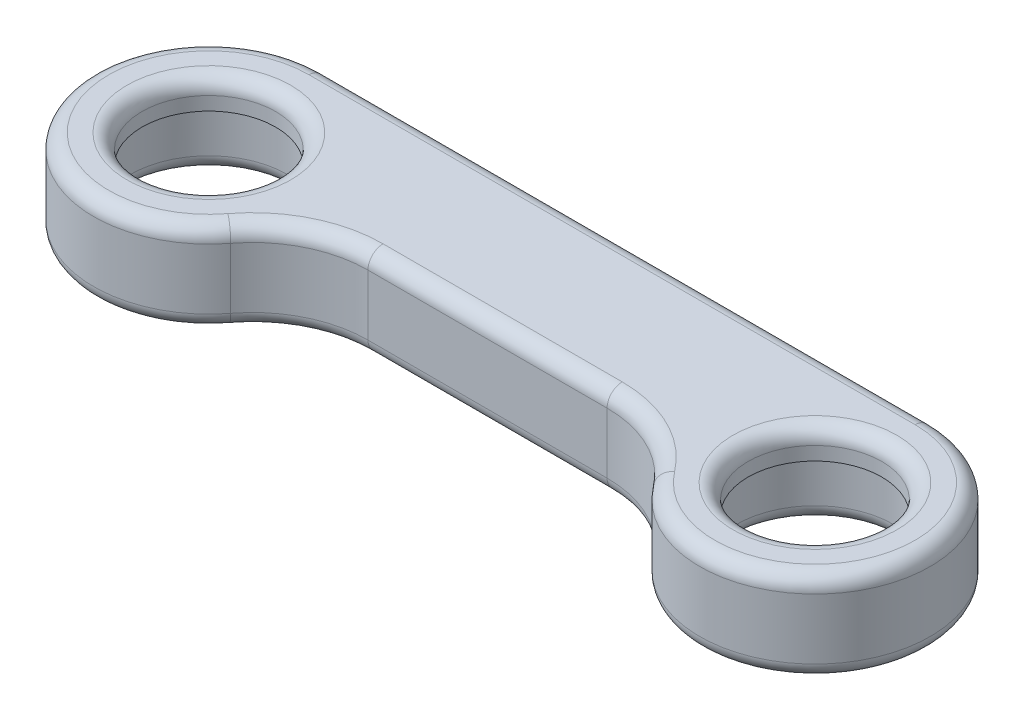
ISO-10303-21;
HEADER;
FILE_DESCRIPTION(('STEP AP214'),'2;1');
FILE_NAME('part.step','',(''),(''),'','','');
FILE_SCHEMA(('AUTOMOTIVE_DESIGN { 1 0 10303 214 1 1 1 1 }'));
ENDSEC;
DATA;
#1=APPLICATION_CONTEXT('core data for automotive mechanical design processes');
#2=APPLICATION_PROTOCOL_DEFINITION('international standard','automotive_design',2000,#1);
#3=PRODUCT_CONTEXT('',#1,'mechanical');
#4=PRODUCT('Part','Part','',(#3));
#5=PRODUCT_RELATED_PRODUCT_CATEGORY('part','',(#4));
#6=PRODUCT_DEFINITION_FORMATION('','',#4);
#7=PRODUCT_DEFINITION_CONTEXT('part definition',#1,'design');
#8=PRODUCT_DEFINITION('design','',#6,#7);
#9=PRODUCT_DEFINITION_SHAPE('','',#8);
#10=(LENGTH_UNIT() NAMED_UNIT(*) SI_UNIT(.MILLI.,.METRE.));
#11=(NAMED_UNIT(*) PLANE_ANGLE_UNIT() SI_UNIT($,.RADIAN.));
#12=(NAMED_UNIT(*) SI_UNIT($,.STERADIAN.) SOLID_ANGLE_UNIT());
#13=UNCERTAINTY_MEASURE_WITH_UNIT(LENGTH_MEASURE(1.E-05),#10,'distance_accuracy_value','');
#14=(GEOMETRIC_REPRESENTATION_CONTEXT(3) GLOBAL_UNCERTAINTY_ASSIGNED_CONTEXT((#13)) GLOBAL_UNIT_ASSIGNED_CONTEXT((#10,
#11,#12)) REPRESENTATION_CONTEXT('',''));
#15=CARTESIAN_POINT('',(0.,0.,0.));
#16=DIRECTION('',(0.,0.,1.));
#17=DIRECTION('',(1.,0.,0.));
#18=AXIS2_PLACEMENT_3D('',#15,#16,#17);
#19=CARTESIAN_POINT('',(-15.875,4.5,0.));
#20=DIRECTION('',(0.,-1.,0.));
#21=DIRECTION('',(0.,0.,-1.));
#22=AXIS2_PLACEMENT_3D('',#19,#20,#21);
#23=CYLINDRICAL_SURFACE('',#22,6.04);
#24=DIRECTION('',(0.,1.,0.));
#25=VECTOR('',#24,1.);
#26=CARTESIAN_POINT('',(-11.0692588045651,1.2375,3.65875));
#27=LINE('',#26,#25);
#28=CARTESIAN_POINT('',(-11.0692588045651,2.03125,3.65875));
#29=VERTEX_POINT('',#28);
#30=CARTESIAN_POINT('',(-11.0692588045651,5.20625,3.65875));
#31=VERTEX_POINT('',#30);
#32=EDGE_CURVE('E323',#29,#31,#27,.T.);
#33=ORIENTED_EDGE('',*,*,#32,.T.);
#34=CARTESIAN_POINT('',(-15.875,5.20625,0.));
#35=DIRECTION('',(0.,-1.,0.));
#36=DIRECTION('',(0.,0.,-1.));
#37=AXIS2_PLACEMENT_3D('',#34,#35,#36);
#38=CIRCLE('',#37,6.04);
#39=CARTESIAN_POINT('',(-15.875,5.20625,-6.04));
#40=VERTEX_POINT('',#39);
#41=EDGE_CURVE('E274',#31,#40,#38,.T.);
#42=ORIENTED_EDGE('',*,*,#41,.T.);
#43=DIRECTION('',(0.,-1.,0.));
#44=VECTOR('',#43,1.);
#45=CARTESIAN_POINT('',(-15.875,4.5,-6.04));
#46=LINE('',#45,#44);
#47=CARTESIAN_POINT('',(-15.875,2.03125,-6.04));
#48=VERTEX_POINT('',#47);
#49=EDGE_CURVE('E322',#40,#48,#46,.T.);
#50=ORIENTED_EDGE('',*,*,#49,.T.);
#51=CARTESIAN_POINT('',(-15.875,2.03125,0.));
#52=DIRECTION('',(0.,-1.,0.));
#53=DIRECTION('',(0.,0.,-1.));
#54=AXIS2_PLACEMENT_3D('',#51,#52,#53);
#55=CIRCLE('',#54,6.04);
#56=EDGE_CURVE('E212',#48,#29,#55,.F.);
#57=ORIENTED_EDGE('',*,*,#56,.T.);
#58=EDGE_LOOP('',(#33,#42,#50,#57));
#59=FACE_BOUND('',#58,.T.);
#60=ADVANCED_FACE('F40',(#59),#23,.T.);
#61=CARTESIAN_POINT('',(15.875,4.5,0.));
#62=DIRECTION('',(0.,-1.,0.));
#63=DIRECTION('',(0.,0.,-1.));
#64=AXIS2_PLACEMENT_3D('',#61,#62,#63);
#65=CYLINDRICAL_SURFACE('',#64,6.04);
#66=DIRECTION('',(0.,-1.,0.));
#67=VECTOR('',#66,1.);
#68=CARTESIAN_POINT('',(15.875,4.5,-6.04));
#69=LINE('',#68,#67);
#70=CARTESIAN_POINT('',(15.875,5.20625,-6.04));
#71=VERTEX_POINT('',#70);
#72=CARTESIAN_POINT('',(15.875,2.03125,-6.04));
#73=VERTEX_POINT('',#72);
#74=EDGE_CURVE('E329',#71,#73,#69,.T.);
#75=ORIENTED_EDGE('',*,*,#74,.F.);
#76=CARTESIAN_POINT('',(15.875,5.20625,0.));
#77=DIRECTION('',(0.,-1.,0.));
#78=DIRECTION('',(0.,0.,-1.));
#79=AXIS2_PLACEMENT_3D('',#76,#77,#78);
#80=CIRCLE('',#79,6.04);
#81=CARTESIAN_POINT('',(11.0692588045651,5.20625,3.65875));
#82=VERTEX_POINT('',#81);
#83=EDGE_CURVE('E264',#71,#82,#80,.T.);
#84=ORIENTED_EDGE('',*,*,#83,.T.);
#85=DIRECTION('',(0.,1.,0.));
#86=VECTOR('',#85,1.);
#87=CARTESIAN_POINT('',(11.0692588045651,1.2375,3.65875));
#88=LINE('',#87,#86);
#89=CARTESIAN_POINT('',(11.0692588045651,2.03125,3.65875));
#90=VERTEX_POINT('',#89);
#91=EDGE_CURVE('E233',#90,#82,#88,.T.);
#92=ORIENTED_EDGE('',*,*,#91,.F.);
#93=CARTESIAN_POINT('',(15.875,2.03125,0.));
#94=DIRECTION('',(0.,-1.,0.));
#95=DIRECTION('',(0.,0.,-1.));
#96=AXIS2_PLACEMENT_3D('',#93,#94,#95);
#97=CIRCLE('',#96,6.04);
#98=EDGE_CURVE('E204',#90,#73,#97,.F.);
#99=ORIENTED_EDGE('',*,*,#98,.T.);
#100=EDGE_LOOP('',(#75,#84,#92,#99));
#101=FACE_BOUND('',#100,.T.);
#102=ADVANCED_FACE('F402',(#101),#65,.T.);
#103=CARTESIAN_POINT('',(-15.875,4.5,-6.04));
#104=DIRECTION('',(0.,0.,1.));
#105=DIRECTION('',(1.,0.,0.));
#106=AXIS2_PLACEMENT_3D('',#103,#104,#105);
#107=PLANE('',#106);
#108=ORIENTED_EDGE('',*,*,#49,.F.);
#109=DIRECTION('',(1.,0.,0.));
#110=VECTOR('',#109,1.);
#111=CARTESIAN_POINT('',(-15.875,5.20625,-6.04));
#112=LINE('',#111,#110);
#113=EDGE_CURVE('E217',#40,#71,#112,.T.);
#114=ORIENTED_EDGE('',*,*,#113,.T.);
#115=ORIENTED_EDGE('',*,*,#74,.T.);
#116=DIRECTION('',(-1.,0.,0.));
#117=VECTOR('',#116,1.);
#118=CARTESIAN_POINT('',(-15.875,2.03125,-6.04));
#119=LINE('',#118,#117);
#120=EDGE_CURVE('E208',#73,#48,#119,.T.);
#121=ORIENTED_EDGE('',*,*,#120,.T.);
#122=EDGE_LOOP('',(#108,#114,#115,#121));
#123=FACE_BOUND('',#122,.T.);
#124=ADVANCED_FACE('F325',(#123),#107,.F.);
#125=CARTESIAN_POINT('',(-15.875,4.5,0.));
#126=DIRECTION('',(0.,-1.,0.));
#127=DIRECTION('',(0.,0.,-1.));
#128=AXIS2_PLACEMENT_3D('',#125,#126,#127);
#129=CYLINDRICAL_SURFACE('',#128,4.125);
#130=CARTESIAN_POINT('',(-15.875,2.03125,0.));
#131=DIRECTION('',(0.,-1.,0.));
#132=DIRECTION('',(0.,0.,-1.));
#133=AXIS2_PLACEMENT_3D('',#130,#131,#132);
#134=CIRCLE('',#133,4.125);
#135=CARTESIAN_POINT('',(-15.875,2.03125,-4.125));
#136=VERTEX_POINT('',#135);
#137=EDGE_CURVE('E195',#136,#136,#134,.T.);
#138=ORIENTED_EDGE('',*,*,#137,.T.);
#139=EDGE_LOOP('',(#138));
#140=FACE_BOUND('',#139,.T.);
#141=CARTESIAN_POINT('',(-15.875,4.5,0.));
#142=DIRECTION('',(0.,1.,0.));
#143=DIRECTION('',(0.,0.,1.));
#144=AXIS2_PLACEMENT_3D('',#141,#142,#143);
#145=CIRCLE('',#144,4.125);
#146=CARTESIAN_POINT('',(-15.875,4.5,4.125));
#147=VERTEX_POINT('',#146);
#148=EDGE_CURVE('E330',#147,#147,#145,.T.);
#149=ORIENTED_EDGE('',*,*,#148,.T.);
#150=EDGE_LOOP('',(#149));
#151=FACE_BOUND('',#150,.T.);
#152=ADVANCED_FACE('F477',(#140,#151),#129,.F.);
#153=CARTESIAN_POINT('',(15.875,4.5,0.));
#154=DIRECTION('',(0.,-1.,0.));
#155=DIRECTION('',(0.,0.,-1.));
#156=AXIS2_PLACEMENT_3D('',#153,#154,#155);
#157=CYLINDRICAL_SURFACE('',#156,4.12500000000001);
#158=CARTESIAN_POINT('',(15.875,2.03125,0.));
#159=DIRECTION('',(0.,-1.,0.));
#160=DIRECTION('',(0.,0.,-1.));
#161=AXIS2_PLACEMENT_3D('',#158,#159,#160);
#162=CIRCLE('',#161,4.12500000000001);
#163=CARTESIAN_POINT('',(15.875,2.03125,-4.12500000000001));
#164=VERTEX_POINT('',#163);
#165=EDGE_CURVE('E174',#164,#164,#162,.T.);
#166=ORIENTED_EDGE('',*,*,#165,.T.);
#167=EDGE_LOOP('',(#166));
#168=FACE_BOUND('',#167,.T.);
#169=CARTESIAN_POINT('',(15.875,4.5,0.));
#170=DIRECTION('',(0.,1.,0.));
#171=DIRECTION('',(0.,0.,1.));
#172=AXIS2_PLACEMENT_3D('',#169,#170,#171);
#173=CIRCLE('',#172,4.12500000000001);
#174=CARTESIAN_POINT('',(15.875,4.5,4.12500000000001));
#175=VERTEX_POINT('',#174);
#176=EDGE_CURVE('E336',#175,#175,#173,.T.);
#177=ORIENTED_EDGE('',*,*,#176,.T.);
#178=EDGE_LOOP('',(#177));
#179=FACE_BOUND('',#178,.T.);
#180=ADVANCED_FACE('F384',(#168,#179),#157,.F.);
#181=CARTESIAN_POINT('',(-15.875,4.5,0.));
#182=DIRECTION('',(0.,1.,0.));
#183=DIRECTION('',(0.,0.,1.));
#184=AXIS2_PLACEMENT_3D('',#181,#182,#183);
#185=PLANE('',#184);
#186=CARTESIAN_POINT('',(-15.875,4.5,0.));
#187=DIRECTION('',(0.,1.,0.));
#188=DIRECTION('',(0.,0.,1.));
#189=AXIS2_PLACEMENT_3D('',#186,#187,#188);
#190=CIRCLE('',#189,3.5);
#191=CARTESIAN_POINT('',(-15.875,4.5,3.5));
#192=VERTEX_POINT('',#191);
#193=EDGE_CURVE('E373',#192,#192,#190,.T.);
#194=ORIENTED_EDGE('',*,*,#193,.T.);
#195=EDGE_LOOP('',(#194));
#196=FACE_BOUND('',#195,.T.);
#197=ORIENTED_EDGE('',*,*,#148,.F.);
#198=EDGE_LOOP('',(#197));
#199=FACE_BOUND('',#198,.T.);
#200=ADVANCED_FACE('F389',(#196,#199),#185,.F.);
#201=CARTESIAN_POINT('',(15.875,4.5,0.));
#202=DIRECTION('',(0.,1.,0.));
#203=DIRECTION('',(0.,0.,1.));
#204=AXIS2_PLACEMENT_3D('',#201,#202,#203);
#205=CIRCLE('',#204,3.5);
#206=CARTESIAN_POINT('',(15.875,4.5,3.5));
#207=VERTEX_POINT('',#206);
#208=EDGE_CURVE('E377',#207,#207,#205,.T.);
#209=ORIENTED_EDGE('',*,*,#208,.T.);
#210=EDGE_LOOP('',(#209));
#211=FACE_BOUND('',#210,.T.);
#212=ORIENTED_EDGE('',*,*,#176,.F.);
#213=EDGE_LOOP('',(#212));
#214=FACE_BOUND('',#213,.T.);
#215=ADVANCED_FACE('F386',(#211,#214),#185,.F.);
#216=CARTESIAN_POINT('',(-15.875,57.4642199977081,0.));
#217=DIRECTION('',(0.,-1.,0.));
#218=DIRECTION('',(0.,0.,-1.));
#219=AXIS2_PLACEMENT_3D('',#216,#217,#218);
#220=CYLINDRICAL_SURFACE('',#219,3.5);
#221=CARTESIAN_POINT('',(-15.875,5.20625,0.));
#222=DIRECTION('',(0.,-1.,0.));
#223=DIRECTION('',(0.,0.,-1.));
#224=AXIS2_PLACEMENT_3D('',#221,#222,#223);
#225=CIRCLE('',#224,3.5);
#226=CARTESIAN_POINT('',(-15.875,5.20625,-3.5));
#227=VERTEX_POINT('',#226);
#228=EDGE_CURVE('E50',#227,#227,#225,.F.);
#229=ORIENTED_EDGE('',*,*,#228,.T.);
#230=EDGE_LOOP('',(#229));
#231=FACE_BOUND('',#230,.T.);
#232=ORIENTED_EDGE('',*,*,#193,.F.);
#233=EDGE_LOOP('',(#232));
#234=FACE_BOUND('',#233,.T.);
#235=ADVANCED_FACE('F388',(#231,#234),#220,.F.);
#236=CARTESIAN_POINT('',(15.875,57.4642199977081,0.));
#237=DIRECTION('',(0.,-1.,0.));
#238=DIRECTION('',(0.,0.,-1.));
#239=AXIS2_PLACEMENT_3D('',#236,#237,#238);
#240=CYLINDRICAL_SURFACE('',#239,3.5);
#241=CARTESIAN_POINT('',(15.875,5.20625,0.));
#242=DIRECTION('',(0.,-1.,0.));
#243=DIRECTION('',(0.,0.,-1.));
#244=AXIS2_PLACEMENT_3D('',#241,#242,#243);
#245=CIRCLE('',#244,3.5);
#246=CARTESIAN_POINT('',(15.875,5.20625,-3.5));
#247=VERTEX_POINT('',#246);
#248=EDGE_CURVE('E12',#247,#247,#245,.F.);
#249=ORIENTED_EDGE('',*,*,#248,.T.);
#250=EDGE_LOOP('',(#249));
#251=FACE_BOUND('',#250,.T.);
#252=ORIENTED_EDGE('',*,*,#208,.F.);
#253=EDGE_LOOP('',(#252));
#254=FACE_BOUND('',#253,.T.);
#255=ADVANCED_FACE('F396',(#251,#254),#240,.F.);
#256=CARTESIAN_POINT('',(-15.875,6.,0.));
#257=DIRECTION('',(0.,-1.,0.));
#258=DIRECTION('',(0.,0.,-1.));
#259=AXIS2_PLACEMENT_3D('',#256,#257,#258);
#260=PLANE('',#259);
#261=CARTESIAN_POINT('',(15.875,6.,0.));
#262=DIRECTION('',(0.,-1.,0.));
#263=DIRECTION('',(0.,0.,-1.));
#264=AXIS2_PLACEMENT_3D('',#261,#262,#263);
#265=CIRCLE('',#264,5.24625);
#266=CARTESIAN_POINT('',(11.7008079889817,6.,3.17793330918874));
#267=VERTEX_POINT('',#266);
#268=CARTESIAN_POINT('',(15.875,6.,-5.24625));
#269=VERTEX_POINT('',#268);
#270=EDGE_CURVE('E257',#267,#269,#265,.F.);
#271=ORIENTED_EDGE('',*,*,#270,.T.);
#272=DIRECTION('',(1.,0.,0.));
#273=VECTOR('',#272,1.);
#274=CARTESIAN_POINT('',(-15.875,6.,-5.24625));
#275=LINE('',#274,#273);
#276=CARTESIAN_POINT('',(-15.875,6.,-5.24625));
#277=VERTEX_POINT('',#276);
#278=EDGE_CURVE('E260',#269,#277,#275,.F.);
#279=ORIENTED_EDGE('',*,*,#278,.T.);
#280=CARTESIAN_POINT('',(-15.875,6.,0.));
#281=DIRECTION('',(0.,-1.,0.));
#282=DIRECTION('',(0.,0.,-1.));
#283=AXIS2_PLACEMENT_3D('',#280,#281,#282);
#284=CIRCLE('',#283,5.24625);
#285=CARTESIAN_POINT('',(-11.7008079889817,6.,3.17793330918874));
#286=VERTEX_POINT('',#285);
#287=EDGE_CURVE('E245',#277,#286,#284,.F.);
#288=ORIENTED_EDGE('',*,*,#287,.T.);
#289=CARTESIAN_POINT('',(-6.26351760913021,6.,7.3175));
#290=DIRECTION('',(0.,-1.,0.));
#291=DIRECTION('',(0.,0.,-1.));
#292=AXIS2_PLACEMENT_3D('',#289,#290,#291);
#293=CIRCLE('',#292,6.83375);
#294=CARTESIAN_POINT('',(-6.26351760913021,6.,0.48375));
#295=VERTEX_POINT('',#294);
#296=EDGE_CURVE('E248',#286,#295,#293,.T.);
#297=ORIENTED_EDGE('',*,*,#296,.T.);
#298=DIRECTION('',(-1.,0.,0.));
#299=VECTOR('',#298,1.);
#300=CARTESIAN_POINT('',(-15.875,6.,0.48375));
#301=LINE('',#300,#299);
#302=CARTESIAN_POINT('',(6.26351760913021,6.,0.48375));
#303=VERTEX_POINT('',#302);
#304=EDGE_CURVE('E251',#295,#303,#301,.F.);
#305=ORIENTED_EDGE('',*,*,#304,.T.);
#306=CARTESIAN_POINT('',(6.26351760913021,6.,7.3175));
#307=DIRECTION('',(0.,-1.,0.));
#308=DIRECTION('',(0.,0.,-1.));
#309=AXIS2_PLACEMENT_3D('',#306,#307,#308);
#310=CIRCLE('',#309,6.83375);
#311=EDGE_CURVE('E254',#303,#267,#310,.T.);
#312=ORIENTED_EDGE('',*,*,#311,.T.);
#313=EDGE_LOOP('',(#271,#279,#288,#297,#305,#312));
#314=FACE_BOUND('',#313,.T.);
#315=CARTESIAN_POINT('',(-15.875,6.,0.));
#316=DIRECTION('',(0.,-1.,0.));
#317=DIRECTION('',(0.,0.,-1.));
#318=AXIS2_PLACEMENT_3D('',#315,#316,#317);
#319=CIRCLE('',#318,4.29375);
#320=CARTESIAN_POINT('',(-15.875,6.,-4.29375));
#321=VERTEX_POINT('',#320);
#322=EDGE_CURVE('E241',#321,#321,#319,.T.);
#323=ORIENTED_EDGE('',*,*,#322,.T.);
#324=EDGE_LOOP('',(#323));
#325=FACE_BOUND('',#324,.T.);
#326=CARTESIAN_POINT('',(15.875,6.,0.));
#327=DIRECTION('',(0.,-1.,0.));
#328=DIRECTION('',(0.,0.,-1.));
#329=AXIS2_PLACEMENT_3D('',#326,#327,#328);
#330=CIRCLE('',#329,4.29375);
#331=CARTESIAN_POINT('',(15.875,6.,-4.29375));
#332=VERTEX_POINT('',#331);
#333=EDGE_CURVE('E237',#332,#332,#330,.T.);
#334=ORIENTED_EDGE('',*,*,#333,.T.);
#335=EDGE_LOOP('',(#334));
#336=FACE_BOUND('',#335,.T.);
#337=ADVANCED_FACE('F310',(#314,#325,#336),#260,.F.);
#338=CARTESIAN_POINT('',(-15.875,1.2375,0.));
#339=DIRECTION('',(0.,-1.,0.));
#340=DIRECTION('',(0.,0.,-1.));
#341=AXIS2_PLACEMENT_3D('',#338,#339,#340);
#342=PLANE('',#341);
#343=CARTESIAN_POINT('',(15.875,1.2375,0.));
#344=DIRECTION('',(0.,-1.,0.));
#345=DIRECTION('',(0.,0.,-1.));
#346=AXIS2_PLACEMENT_3D('',#343,#344,#345);
#347=CIRCLE('',#346,4.91875000000001);
#348=CARTESIAN_POINT('',(15.875,1.2375,-4.91875000000001));
#349=VERTEX_POINT('',#348);
#350=EDGE_CURVE('E185',#349,#349,#347,.F.);
#351=ORIENTED_EDGE('',*,*,#350,.T.);
#352=EDGE_LOOP('',(#351));
#353=FACE_BOUND('',#352,.T.);
#354=CARTESIAN_POINT('',(-15.875,1.2375,0.));
#355=DIRECTION('',(0.,-1.,0.));
#356=DIRECTION('',(0.,0.,-1.));
#357=AXIS2_PLACEMENT_3D('',#354,#355,#356);
#358=CIRCLE('',#357,4.91875);
#359=CARTESIAN_POINT('',(-15.875,1.2375,-4.91875));
#360=VERTEX_POINT('',#359);
#361=EDGE_CURVE('E181',#360,#360,#358,.F.);
#362=ORIENTED_EDGE('',*,*,#361,.T.);
#363=EDGE_LOOP('',(#362));
#364=FACE_BOUND('',#363,.T.);
#365=CARTESIAN_POINT('',(6.26351760913021,1.2375,7.3175));
#366=DIRECTION('',(0.,-1.,0.));
#367=DIRECTION('',(0.,0.,-1.));
#368=AXIS2_PLACEMENT_3D('',#365,#366,#367);
#369=CIRCLE('',#368,6.83375);
#370=CARTESIAN_POINT('',(11.7008079889817,1.2375,3.17793330918874));
#371=VERTEX_POINT('',#370);
#372=CARTESIAN_POINT('',(6.26351760913021,1.2375,0.48375));
#373=VERTEX_POINT('',#372);
#374=EDGE_CURVE('E178',#371,#373,#369,.F.);
#375=ORIENTED_EDGE('',*,*,#374,.T.);
#376=DIRECTION('',(-1.,0.,0.));
#377=VECTOR('',#376,1.);
#378=CARTESIAN_POINT('',(-6.26351760913021,1.2375,0.48375));
#379=LINE('',#378,#377);
#380=CARTESIAN_POINT('',(-6.26351760913021,1.2375,0.48375));
#381=VERTEX_POINT('',#380);
#382=EDGE_CURVE('E157',#373,#381,#379,.T.);
#383=ORIENTED_EDGE('',*,*,#382,.T.);
#384=CARTESIAN_POINT('',(-6.26351760913021,1.2375,7.3175));
#385=DIRECTION('',(0.,-1.,0.));
#386=DIRECTION('',(0.,0.,-1.));
#387=AXIS2_PLACEMENT_3D('',#384,#385,#386);
#388=CIRCLE('',#387,6.83375);
#389=CARTESIAN_POINT('',(-11.7008079889817,1.2375,3.17793330918874));
#390=VERTEX_POINT('',#389);
#391=EDGE_CURVE('E166',#381,#390,#388,.F.);
#392=ORIENTED_EDGE('',*,*,#391,.T.);
#393=CARTESIAN_POINT('',(-15.875,1.2375,0.));
#394=DIRECTION('',(0.,-1.,0.));
#395=DIRECTION('',(0.,0.,-1.));
#396=AXIS2_PLACEMENT_3D('',#393,#394,#395);
#397=CIRCLE('',#396,5.24625);
#398=CARTESIAN_POINT('',(-15.875,1.2375,-5.24625));
#399=VERTEX_POINT('',#398);
#400=EDGE_CURVE('E173',#390,#399,#397,.T.);
#401=ORIENTED_EDGE('',*,*,#400,.T.);
#402=DIRECTION('',(-1.,0.,0.));
#403=VECTOR('',#402,1.);
#404=CARTESIAN_POINT('',(15.875,1.2375,-5.24625));
#405=LINE('',#404,#403);
#406=CARTESIAN_POINT('',(15.875,1.2375,-5.24625));
#407=VERTEX_POINT('',#406);
#408=EDGE_CURVE('E345',#399,#407,#405,.F.);
#409=ORIENTED_EDGE('',*,*,#408,.T.);
#410=CARTESIAN_POINT('',(15.875,1.2375,0.));
#411=DIRECTION('',(0.,-1.,0.));
#412=DIRECTION('',(0.,0.,-1.));
#413=AXIS2_PLACEMENT_3D('',#410,#411,#412);
#414=CIRCLE('',#413,5.24625);
#415=EDGE_CURVE('E188',#407,#371,#414,.T.);
#416=ORIENTED_EDGE('',*,*,#415,.T.);
#417=EDGE_LOOP('',(#375,#383,#392,#401,#409,#416));
#418=FACE_BOUND('',#417,.T.);
#419=ADVANCED_FACE('F176',(#353,#364,#418),#342,.T.);
#420=CARTESIAN_POINT('',(-6.26351760913021,1.2375,7.3175));
#421=DIRECTION('',(0.,1.,0.));
#422=DIRECTION('',(0.,0.,1.));
#423=AXIS2_PLACEMENT_3D('',#420,#421,#422);
#424=CYLINDRICAL_SURFACE('',#423,6.04);
#425=DIRECTION('',(0.,1.,0.));
#426=VECTOR('',#425,1.);
#427=CARTESIAN_POINT('',(-6.26351760913021,1.2375,1.2775));
#428=LINE('',#427,#426);
#429=CARTESIAN_POINT('',(-6.26351760913021,2.03125,1.2775));
#430=VERTEX_POINT('',#429);
#431=CARTESIAN_POINT('',(-6.26351760913021,5.20625,1.2775));
#432=VERTEX_POINT('',#431);
#433=EDGE_CURVE('E364',#430,#432,#428,.T.);
#434=ORIENTED_EDGE('',*,*,#433,.T.);
#435=CARTESIAN_POINT('',(-6.26351760913021,5.20625,7.3175));
#436=DIRECTION('',(0.,-1.,0.));
#437=DIRECTION('',(0.,0.,-1.));
#438=AXIS2_PLACEMENT_3D('',#435,#436,#437);
#439=CIRCLE('',#438,6.04);
#440=EDGE_CURVE('E61',#432,#31,#439,.F.);
#441=ORIENTED_EDGE('',*,*,#440,.T.);
#442=ORIENTED_EDGE('',*,*,#32,.F.);
#443=CARTESIAN_POINT('',(-6.26351760913021,2.03125,7.3175));
#444=DIRECTION('',(0.,-1.,0.));
#445=DIRECTION('',(0.,0.,-1.));
#446=AXIS2_PLACEMENT_3D('',#443,#444,#445);
#447=CIRCLE('',#446,6.04);
#448=EDGE_CURVE('E215',#29,#430,#447,.T.);
#449=ORIENTED_EDGE('',*,*,#448,.T.);
#450=EDGE_LOOP('',(#434,#441,#442,#449));
#451=FACE_BOUND('',#450,.T.);
#452=ADVANCED_FACE('F470',(#451),#424,.F.);
#453=CARTESIAN_POINT('',(-6.26351760913021,1.2375,1.2775));
#454=DIRECTION('',(0.,0.,-1.));
#455=DIRECTION('',(-1.,0.,0.));
#456=AXIS2_PLACEMENT_3D('',#453,#454,#455);
#457=PLANE('',#456);
#458=DIRECTION('',(0.,1.,0.));
#459=VECTOR('',#458,1.);
#460=CARTESIAN_POINT('',(6.26351760913021,1.2375,1.2775));
#461=LINE('',#460,#459);
#462=CARTESIAN_POINT('',(6.26351760913021,2.03125,1.2775));
#463=VERTEX_POINT('',#462);
#464=CARTESIAN_POINT('',(6.26351760913021,5.20625,1.2775));
#465=VERTEX_POINT('',#464);
#466=EDGE_CURVE('E363',#463,#465,#461,.T.);
#467=ORIENTED_EDGE('',*,*,#466,.T.);
#468=DIRECTION('',(-1.,0.,0.));
#469=VECTOR('',#468,1.);
#470=CARTESIAN_POINT('',(-6.26351760913021,5.20625,1.2775));
#471=LINE('',#470,#469);
#472=EDGE_CURVE('E70',#465,#432,#471,.T.);
#473=ORIENTED_EDGE('',*,*,#472,.T.);
#474=ORIENTED_EDGE('',*,*,#433,.F.);
#475=DIRECTION('',(-1.,0.,0.));
#476=VECTOR('',#475,1.);
#477=CARTESIAN_POINT('',(6.26351760913021,2.03125,1.2775));
#478=LINE('',#477,#476);
#479=EDGE_CURVE('E159',#430,#463,#478,.F.);
#480=ORIENTED_EDGE('',*,*,#479,.T.);
#481=EDGE_LOOP('',(#467,#473,#474,#480));
#482=FACE_BOUND('',#481,.T.);
#483=ADVANCED_FACE('F362',(#482),#457,.F.);
#484=CARTESIAN_POINT('',(6.26351760913021,1.2375,7.3175));
#485=DIRECTION('',(0.,1.,0.));
#486=DIRECTION('',(0.,0.,1.));
#487=AXIS2_PLACEMENT_3D('',#484,#485,#486);
#488=CYLINDRICAL_SURFACE('',#487,6.04);
#489=ORIENTED_EDGE('',*,*,#91,.T.);
#490=CARTESIAN_POINT('',(6.26351760913021,5.20625,7.3175));
#491=DIRECTION('',(0.,-1.,0.));
#492=DIRECTION('',(0.,0.,-1.));
#493=AXIS2_PLACEMENT_3D('',#490,#491,#492);
#494=CIRCLE('',#493,6.04);
#495=EDGE_CURVE('E267',#82,#465,#494,.F.);
#496=ORIENTED_EDGE('',*,*,#495,.T.);
#497=ORIENTED_EDGE('',*,*,#466,.F.);
#498=CARTESIAN_POINT('',(6.26351760913021,2.03125,7.3175));
#499=DIRECTION('',(0.,-1.,0.));
#500=DIRECTION('',(0.,0.,-1.));
#501=AXIS2_PLACEMENT_3D('',#498,#499,#500);
#502=CIRCLE('',#501,6.04);
#503=EDGE_CURVE('E201',#463,#90,#502,.T.);
#504=ORIENTED_EDGE('',*,*,#503,.T.);
#505=EDGE_LOOP('',(#489,#496,#497,#504));
#506=FACE_BOUND('',#505,.T.);
#507=ADVANCED_FACE('F365',(#506),#488,.F.);
#508=CARTESIAN_POINT('',(15.875,2.03125,0.));
#509=DIRECTION('',(0.,-1.,0.));
#510=DIRECTION('',(0.,0.,-1.));
#511=AXIS2_PLACEMENT_3D('',#508,#509,#510);
#512=TOROIDAL_SURFACE('',#511,4.91875000000001,0.79375);
#513=ORIENTED_EDGE('',*,*,#350,.F.);
#514=EDGE_LOOP('',(#513));
#515=FACE_BOUND('',#514,.T.);
#516=ORIENTED_EDGE('',*,*,#165,.F.);
#517=EDGE_LOOP('',(#516));
#518=FACE_BOUND('',#517,.T.);
#519=ADVANCED_FACE('F411',(#515,#518),#512,.T.);
#520=CARTESIAN_POINT('',(-15.875,2.03125,0.));
#521=DIRECTION('',(0.,-1.,0.));
#522=DIRECTION('',(0.,0.,-1.));
#523=AXIS2_PLACEMENT_3D('',#520,#521,#522);
#524=TOROIDAL_SURFACE('',#523,4.91875,0.79375);
#525=ORIENTED_EDGE('',*,*,#361,.F.);
#526=EDGE_LOOP('',(#525));
#527=FACE_BOUND('',#526,.T.);
#528=ORIENTED_EDGE('',*,*,#137,.F.);
#529=EDGE_LOOP('',(#528));
#530=FACE_BOUND('',#529,.T.);
#531=ADVANCED_FACE('F414',(#527,#530),#524,.T.);
#532=CARTESIAN_POINT('',(-15.875,2.03125,-5.24625));
#533=DIRECTION('',(1.,0.,0.));
#534=DIRECTION('',(0.,0.,-1.));
#535=AXIS2_PLACEMENT_3D('',#532,#533,#534);
#536=CYLINDRICAL_SURFACE('',#535,0.79375);
#537=CARTESIAN_POINT('',(-15.875,2.03125,-5.24625));
#538=DIRECTION('',(-1.,0.,0.));
#539=DIRECTION('',(0.,0.,1.));
#540=AXIS2_PLACEMENT_3D('',#537,#538,#539);
#541=CIRCLE('',#540,0.79375);
#542=EDGE_CURVE('E226',#48,#399,#541,.T.);
#543=ORIENTED_EDGE('',*,*,#542,.F.);
#544=ORIENTED_EDGE('',*,*,#120,.F.);
#545=CARTESIAN_POINT('',(15.875,2.03125,-5.24625));
#546=DIRECTION('',(1.,0.,0.));
#547=DIRECTION('',(0.,0.,-1.));
#548=AXIS2_PLACEMENT_3D('',#545,#546,#547);
#549=CIRCLE('',#548,0.79375);
#550=EDGE_CURVE('E229',#407,#73,#549,.T.);
#551=ORIENTED_EDGE('',*,*,#550,.F.);
#552=ORIENTED_EDGE('',*,*,#408,.F.);
#553=EDGE_LOOP('',(#543,#544,#551,#552));
#554=FACE_BOUND('',#553,.T.);
#555=ADVANCED_FACE('F418',(#554),#536,.T.);
#556=CARTESIAN_POINT('',(15.875,2.03125,0.));
#557=DIRECTION('',(0.,-1.,0.));
#558=DIRECTION('',(0.,0.,-1.));
#559=AXIS2_PLACEMENT_3D('',#556,#557,#558);
#560=TOROIDAL_SURFACE('',#559,5.24625,0.79375);
#561=ORIENTED_EDGE('',*,*,#550,.T.);
#562=ORIENTED_EDGE('',*,*,#98,.F.);
#563=CARTESIAN_POINT('',(11.7008079889817,2.03125,3.17793330918874));
#564=DIRECTION('',(-0.605753311258278,0.,-0.795652515800479));
#565=DIRECTION('',(-0.795652515800479,0.,0.605753311258278));
#566=AXIS2_PLACEMENT_3D('',#563,#564,#565);
#567=CIRCLE('',#566,0.79375);
#568=EDGE_CURVE('E222',#371,#90,#567,.T.);
#569=ORIENTED_EDGE('',*,*,#568,.F.);
#570=ORIENTED_EDGE('',*,*,#415,.F.);
#571=EDGE_LOOP('',(#561,#562,#569,#570));
#572=FACE_BOUND('',#571,.T.);
#573=ADVANCED_FACE('F354',(#572),#560,.T.);
#574=CARTESIAN_POINT('',(-15.875,2.03125,0.));
#575=DIRECTION('',(0.,-1.,0.));
#576=DIRECTION('',(0.,0.,-1.));
#577=AXIS2_PLACEMENT_3D('',#574,#575,#576);
#578=TOROIDAL_SURFACE('',#577,5.24625,0.79375);
#579=ORIENTED_EDGE('',*,*,#542,.T.);
#580=ORIENTED_EDGE('',*,*,#400,.F.);
#581=CARTESIAN_POINT('',(-11.7008079889817,2.03125,3.17793330918874));
#582=DIRECTION('',(0.605753311258278,0.,-0.795652515800479));
#583=DIRECTION('',(-0.795652515800479,0.,-0.605753311258278));
#584=AXIS2_PLACEMENT_3D('',#581,#582,#583);
#585=CIRCLE('',#584,0.79375);
#586=EDGE_CURVE('E169',#29,#390,#585,.T.);
#587=ORIENTED_EDGE('',*,*,#586,.F.);
#588=ORIENTED_EDGE('',*,*,#56,.F.);
#589=EDGE_LOOP('',(#579,#580,#587,#588));
#590=FACE_BOUND('',#589,.T.);
#591=ADVANCED_FACE('F426',(#590),#578,.T.);
#592=CARTESIAN_POINT('',(6.26351760913021,2.03125,7.3175));
#593=DIRECTION('',(0.,-1.,0.));
#594=DIRECTION('',(0.,0.,-1.));
#595=AXIS2_PLACEMENT_3D('',#592,#593,#594);
#596=TOROIDAL_SURFACE('',#595,6.83375,0.79375);
#597=ORIENTED_EDGE('',*,*,#568,.T.);
#598=ORIENTED_EDGE('',*,*,#503,.F.);
#599=CARTESIAN_POINT('',(6.26351760913021,2.03125,0.48375));
#600=DIRECTION('',(-1.,0.,0.));
#601=DIRECTION('',(0.,0.,1.));
#602=AXIS2_PLACEMENT_3D('',#599,#600,#601);
#603=CIRCLE('',#602,0.79375);
#604=EDGE_CURVE('E163',#373,#463,#603,.T.);
#605=ORIENTED_EDGE('',*,*,#604,.F.);
#606=ORIENTED_EDGE('',*,*,#374,.F.);
#607=EDGE_LOOP('',(#597,#598,#605,#606));
#608=FACE_BOUND('',#607,.T.);
#609=ADVANCED_FACE('F357',(#608),#596,.T.);
#610=CARTESIAN_POINT('',(-6.26351760913021,2.03125,7.3175));
#611=DIRECTION('',(0.,-1.,0.));
#612=DIRECTION('',(0.,0.,-1.));
#613=AXIS2_PLACEMENT_3D('',#610,#611,#612);
#614=TOROIDAL_SURFACE('',#613,6.83375,0.79375);
#615=ORIENTED_EDGE('',*,*,#586,.T.);
#616=ORIENTED_EDGE('',*,*,#391,.F.);
#617=CARTESIAN_POINT('',(-6.26351760913021,2.03125,0.48375));
#618=DIRECTION('',(1.,0.,0.));
#619=DIRECTION('',(0.,0.,-1.));
#620=AXIS2_PLACEMENT_3D('',#617,#618,#619);
#621=CIRCLE('',#620,0.79375);
#622=EDGE_CURVE('E153',#430,#381,#621,.T.);
#623=ORIENTED_EDGE('',*,*,#622,.F.);
#624=ORIENTED_EDGE('',*,*,#448,.F.);
#625=EDGE_LOOP('',(#615,#616,#623,#624));
#626=FACE_BOUND('',#625,.T.);
#627=ADVANCED_FACE('F167',(#626),#614,.T.);
#628=CARTESIAN_POINT('',(-15.875,2.03125,0.48375));
#629=DIRECTION('',(1.,0.,0.));
#630=DIRECTION('',(0.,0.,-1.));
#631=AXIS2_PLACEMENT_3D('',#628,#629,#630);
#632=CYLINDRICAL_SURFACE('',#631,0.79375);
#633=ORIENTED_EDGE('',*,*,#604,.T.);
#634=ORIENTED_EDGE('',*,*,#479,.F.);
#635=ORIENTED_EDGE('',*,*,#622,.T.);
#636=ORIENTED_EDGE('',*,*,#382,.F.);
#637=EDGE_LOOP('',(#633,#634,#635,#636));
#638=FACE_BOUND('',#637,.T.);
#639=ADVANCED_FACE('F155',(#638),#632,.T.);
#640=CARTESIAN_POINT('',(-6.26351760913021,5.20625,0.48375));
#641=DIRECTION('',(-1.,0.,0.));
#642=DIRECTION('',(0.,0.,1.));
#643=AXIS2_PLACEMENT_3D('',#640,#641,#642);
#644=CYLINDRICAL_SURFACE('',#643,0.79375);
#645=CARTESIAN_POINT('',(6.26351760913021,5.20625,0.48375));
#646=DIRECTION('',(1.,0.,0.));
#647=DIRECTION('',(0.,0.,-1.));
#648=AXIS2_PLACEMENT_3D('',#645,#646,#647);
#649=CIRCLE('',#648,0.79375);
#650=EDGE_CURVE('E293',#303,#465,#649,.T.);
#651=ORIENTED_EDGE('',*,*,#650,.F.);
#652=ORIENTED_EDGE('',*,*,#304,.F.);
#653=CARTESIAN_POINT('',(-6.26351760913021,5.20625,0.48375));
#654=DIRECTION('',(-1.,0.,0.));
#655=DIRECTION('',(0.,0.,1.));
#656=AXIS2_PLACEMENT_3D('',#653,#654,#655);
#657=CIRCLE('',#656,0.79375);
#658=EDGE_CURVE('E44',#432,#295,#657,.T.);
#659=ORIENTED_EDGE('',*,*,#658,.F.);
#660=ORIENTED_EDGE('',*,*,#472,.F.);
#661=EDGE_LOOP('',(#651,#652,#659,#660));
#662=FACE_BOUND('',#661,.T.);
#663=ADVANCED_FACE('F308',(#662),#644,.T.);
#664=CARTESIAN_POINT('',(-6.26351760913021,5.20625,7.3175));
#665=DIRECTION('',(0.,-1.,0.));
#666=DIRECTION('',(0.,0.,-1.));
#667=AXIS2_PLACEMENT_3D('',#664,#665,#666);
#668=TOROIDAL_SURFACE('',#667,6.83375,0.79375);
#669=ORIENTED_EDGE('',*,*,#658,.T.);
#670=ORIENTED_EDGE('',*,*,#296,.F.);
#671=CARTESIAN_POINT('',(-11.7008079889817,5.20625,3.17793330918874));
#672=DIRECTION('',(-0.605753311258278,0.,0.795652515800479));
#673=DIRECTION('',(0.795652515800479,0.,0.605753311258278));
#674=AXIS2_PLACEMENT_3D('',#671,#672,#673);
#675=CIRCLE('',#674,0.79375);
#676=EDGE_CURVE('E290',#31,#286,#675,.T.);
#677=ORIENTED_EDGE('',*,*,#676,.F.);
#678=ORIENTED_EDGE('',*,*,#440,.F.);
#679=EDGE_LOOP('',(#669,#670,#677,#678));
#680=FACE_BOUND('',#679,.T.);
#681=ADVANCED_FACE('F304',(#680),#668,.T.);
#682=CARTESIAN_POINT('',(6.26351760913021,5.20625,7.3175));
#683=DIRECTION('',(0.,-1.,0.));
#684=DIRECTION('',(0.,0.,-1.));
#685=AXIS2_PLACEMENT_3D('',#682,#683,#684);
#686=TOROIDAL_SURFACE('',#685,6.83375,0.79375);
#687=ORIENTED_EDGE('',*,*,#650,.T.);
#688=ORIENTED_EDGE('',*,*,#495,.F.);
#689=CARTESIAN_POINT('',(11.7008079889817,5.20625,3.17793330918874));
#690=DIRECTION('',(0.605753311258279,0.,0.795652515800478));
#691=DIRECTION('',(0.795652515800479,0.,-0.605753311258279));
#692=AXIS2_PLACEMENT_3D('',#689,#690,#691);
#693=CIRCLE('',#692,0.79375);
#694=EDGE_CURVE('E286',#267,#82,#693,.T.);
#695=ORIENTED_EDGE('',*,*,#694,.F.);
#696=ORIENTED_EDGE('',*,*,#311,.F.);
#697=EDGE_LOOP('',(#687,#688,#695,#696));
#698=FACE_BOUND('',#697,.T.);
#699=ADVANCED_FACE('F446',(#698),#686,.T.);
#700=CARTESIAN_POINT('',(-15.875,5.20625,0.));
#701=DIRECTION('',(0.,-1.,0.));
#702=DIRECTION('',(0.,0.,-1.));
#703=AXIS2_PLACEMENT_3D('',#700,#701,#702);
#704=TOROIDAL_SURFACE('',#703,5.24625,0.79375);
#705=ORIENTED_EDGE('',*,*,#676,.T.);
#706=ORIENTED_EDGE('',*,*,#287,.F.);
#707=CARTESIAN_POINT('',(-15.875,5.20625,-5.24625));
#708=DIRECTION('',(1.,0.,0.));
#709=DIRECTION('',(0.,0.,-1.));
#710=AXIS2_PLACEMENT_3D('',#707,#708,#709);
#711=CIRCLE('',#710,0.79375);
#712=EDGE_CURVE('E283',#40,#277,#711,.T.);
#713=ORIENTED_EDGE('',*,*,#712,.F.);
#714=ORIENTED_EDGE('',*,*,#41,.F.);
#715=EDGE_LOOP('',(#705,#706,#713,#714));
#716=FACE_BOUND('',#715,.T.);
#717=ADVANCED_FACE('F317',(#716),#704,.T.);
#718=CARTESIAN_POINT('',(15.875,5.20625,0.));
#719=DIRECTION('',(0.,-1.,0.));
#720=DIRECTION('',(0.,0.,-1.));
#721=AXIS2_PLACEMENT_3D('',#718,#719,#720);
#722=TOROIDAL_SURFACE('',#721,5.24625,0.79375);
#723=ORIENTED_EDGE('',*,*,#694,.T.);
#724=ORIENTED_EDGE('',*,*,#83,.F.);
#725=CARTESIAN_POINT('',(15.875,5.20625,-5.24625));
#726=DIRECTION('',(-1.,0.,0.));
#727=DIRECTION('',(0.,0.,1.));
#728=AXIS2_PLACEMENT_3D('',#725,#726,#727);
#729=CIRCLE('',#728,0.79375);
#730=EDGE_CURVE('E280',#269,#71,#729,.T.);
#731=ORIENTED_EDGE('',*,*,#730,.F.);
#732=ORIENTED_EDGE('',*,*,#270,.F.);
#733=EDGE_LOOP('',(#723,#724,#731,#732));
#734=FACE_BOUND('',#733,.T.);
#735=ADVANCED_FACE('F439',(#734),#722,.T.);
#736=CARTESIAN_POINT('',(-15.875,5.20625,-5.24625));
#737=DIRECTION('',(1.,0.,0.));
#738=DIRECTION('',(0.,0.,-1.));
#739=AXIS2_PLACEMENT_3D('',#736,#737,#738);
#740=CYLINDRICAL_SURFACE('',#739,0.79375);
#741=ORIENTED_EDGE('',*,*,#712,.T.);
#742=ORIENTED_EDGE('',*,*,#278,.F.);
#743=ORIENTED_EDGE('',*,*,#730,.T.);
#744=ORIENTED_EDGE('',*,*,#113,.F.);
#745=EDGE_LOOP('',(#741,#742,#743,#744));
#746=FACE_BOUND('',#745,.T.);
#747=ADVANCED_FACE('F435',(#746),#740,.T.);
#748=CARTESIAN_POINT('',(-15.875,5.20625,0.));
#749=DIRECTION('',(0.,-1.,0.));
#750=DIRECTION('',(0.,0.,-1.));
#751=AXIS2_PLACEMENT_3D('',#748,#749,#750);
#752=TOROIDAL_SURFACE('',#751,4.29375,0.79375);
#753=ORIENTED_EDGE('',*,*,#228,.F.);
#754=EDGE_LOOP('',(#753));
#755=FACE_BOUND('',#754,.T.);
#756=ORIENTED_EDGE('',*,*,#322,.F.);
#757=EDGE_LOOP('',(#756));
#758=FACE_BOUND('',#757,.T.);
#759=ADVANCED_FACE('F438',(#755,#758),#752,.T.);
#760=CARTESIAN_POINT('',(15.875,5.20625,0.));
#761=DIRECTION('',(0.,-1.,0.));
#762=DIRECTION('',(0.,0.,-1.));
#763=AXIS2_PLACEMENT_3D('',#760,#761,#762);
#764=TOROIDAL_SURFACE('',#763,4.29375,0.79375);
#765=ORIENTED_EDGE('',*,*,#248,.F.);
#766=EDGE_LOOP('',(#765));
#767=FACE_BOUND('',#766,.T.);
#768=ORIENTED_EDGE('',*,*,#333,.F.);
#769=EDGE_LOOP('',(#768));
#770=FACE_BOUND('',#769,.T.);
#771=ADVANCED_FACE('F42',(#767,#770),#764,.T.);
#772=CLOSED_SHELL('',(#60,#102,#124,#152,#180,#200,#215,#235,#255,#337,#419,#452,#483,#507,#519,
#531,#555,#573,#591,#609,#627,#639,#663,#681,#699,#717,#735,#747,#759,#771));
#773=MANIFOLD_SOLID_BREP('B2',#772);
#774=ADVANCED_BREP_SHAPE_REPRESENTATION('',(#18,#773),#14);
#775=SHAPE_DEFINITION_REPRESENTATION(#9,#774);
ENDSEC;
END-ISO-10303-21;
